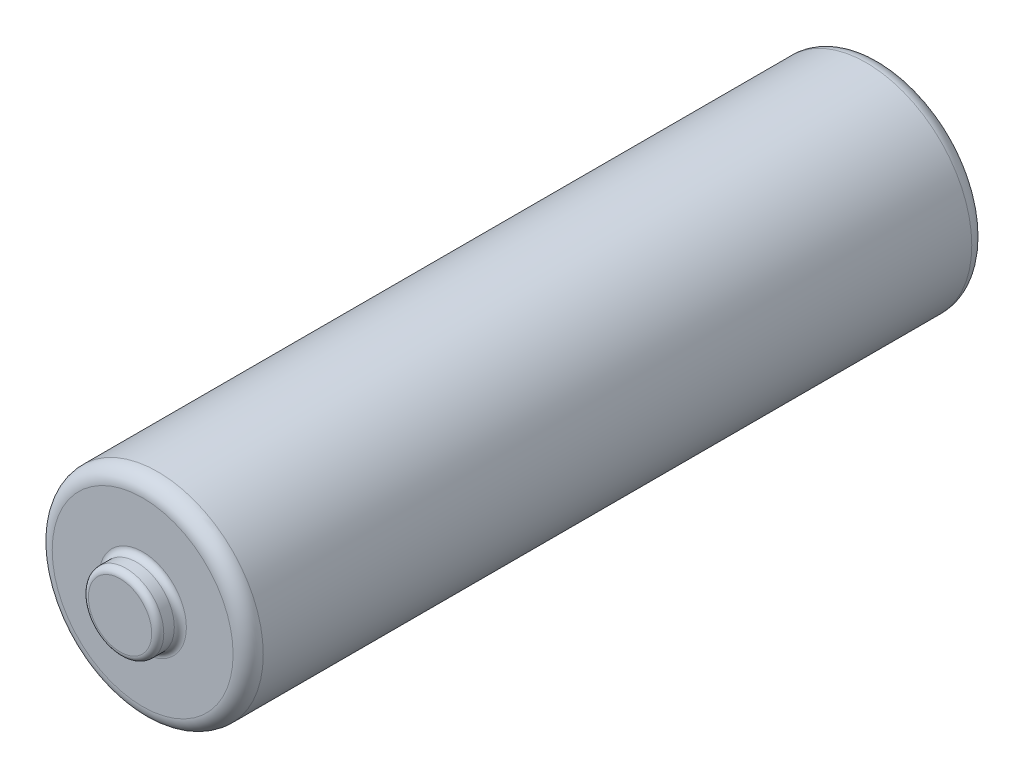
ISO-10303-21;
HEADER;
FILE_DESCRIPTION(('STEP AP214'),'2;1');
FILE_NAME('part.step','',(''),(''),'','','');
FILE_SCHEMA(('AUTOMOTIVE_DESIGN { 1 0 10303 214 1 1 1 1 }'));
ENDSEC;
DATA;
#1=APPLICATION_CONTEXT('core data for automotive mechanical design processes');
#2=APPLICATION_PROTOCOL_DEFINITION('international standard','automotive_design',2000,#1);
#3=PRODUCT_CONTEXT('',#1,'mechanical');
#4=PRODUCT('Part','Part','',(#3));
#5=PRODUCT_RELATED_PRODUCT_CATEGORY('part','',(#4));
#6=PRODUCT_DEFINITION_FORMATION('','',#4);
#7=PRODUCT_DEFINITION_CONTEXT('part definition',#1,'design');
#8=PRODUCT_DEFINITION('design','',#6,#7);
#9=PRODUCT_DEFINITION_SHAPE('','',#8);
#10=(LENGTH_UNIT() NAMED_UNIT(*) SI_UNIT(.MILLI.,.METRE.));
#11=(NAMED_UNIT(*) PLANE_ANGLE_UNIT() SI_UNIT($,.RADIAN.));
#12=(NAMED_UNIT(*) SI_UNIT($,.STERADIAN.) SOLID_ANGLE_UNIT());
#13=UNCERTAINTY_MEASURE_WITH_UNIT(LENGTH_MEASURE(1.E-05),#10,'distance_accuracy_value','');
#14=(GEOMETRIC_REPRESENTATION_CONTEXT(3) GLOBAL_UNCERTAINTY_ASSIGNED_CONTEXT((#13)) GLOBAL_UNIT_ASSIGNED_CONTEXT((#10,
#11,#12)) REPRESENTATION_CONTEXT('',''));
#15=CARTESIAN_POINT('',(0.,0.,0.));
#16=DIRECTION('',(0.,0.,1.));
#17=DIRECTION('',(1.,0.,0.));
#18=AXIS2_PLACEMENT_3D('',#15,#16,#17);
#19=CARTESIAN_POINT('',(0.,0.,49.));
#20=DIRECTION('',(0.,0.,1.));
#21=DIRECTION('',(1.,0.,0.));
#22=AXIS2_PLACEMENT_3D('',#19,#20,#21);
#23=PLANE('',#22);
#24=CARTESIAN_POINT('',(0.,0.,49.));
#25=DIRECTION('',(0.,0.,1.));
#26=DIRECTION('',(1.,0.,0.));
#27=AXIS2_PLACEMENT_3D('',#24,#25,#26);
#28=CIRCLE('',#27,2.9);
#29=CARTESIAN_POINT('',(2.9,0.,49.));
#30=VERTEX_POINT('',#29);
#31=EDGE_CURVE('E12',#30,#30,#28,.F.);
#32=ORIENTED_EDGE('',*,*,#31,.T.);
#33=EDGE_LOOP('',(#32));
#34=FACE_BOUND('',#33,.T.);
#35=CARTESIAN_POINT('',(0.,0.,49.));
#36=DIRECTION('',(0.,0.,1.));
#37=DIRECTION('',(1.,0.,0.));
#38=AXIS2_PLACEMENT_3D('',#35,#36,#37);
#39=CIRCLE('',#38,6.);
#40=CARTESIAN_POINT('',(6.,0.,49.));
#41=VERTEX_POINT('',#40);
#42=EDGE_CURVE('E64',#41,#41,#39,.T.);
#43=ORIENTED_EDGE('',*,*,#42,.T.);
#44=EDGE_LOOP('',(#43));
#45=FACE_BOUND('',#44,.T.);
#46=ADVANCED_FACE('F44',(#34,#45),#23,.T.);
#47=CARTESIAN_POINT('',(0.,0.,49.));
#48=DIRECTION('',(0.,0.,-1.));
#49=DIRECTION('',(-1.,0.,0.));
#50=AXIS2_PLACEMENT_3D('',#47,#48,#49);
#51=CYLINDRICAL_SURFACE('',#50,7.);
#52=CARTESIAN_POINT('',(0.,0.,1.));
#53=DIRECTION('',(0.,0.,1.));
#54=DIRECTION('',(1.,0.,0.));
#55=AXIS2_PLACEMENT_3D('',#52,#53,#54);
#56=CIRCLE('',#55,7.);
#57=CARTESIAN_POINT('',(7.,0.,1.));
#58=VERTEX_POINT('',#57);
#59=EDGE_CURVE('E70',#58,#58,#56,.T.);
#60=ORIENTED_EDGE('',*,*,#59,.T.);
#61=EDGE_LOOP('',(#60));
#62=FACE_BOUND('',#61,.T.);
#63=CARTESIAN_POINT('',(0.,0.,48.));
#64=DIRECTION('',(0.,0.,1.));
#65=DIRECTION('',(1.,0.,0.));
#66=AXIS2_PLACEMENT_3D('',#63,#64,#65);
#67=CIRCLE('',#66,7.);
#68=CARTESIAN_POINT('',(7.,0.,48.));
#69=VERTEX_POINT('',#68);
#70=EDGE_CURVE('E73',#69,#69,#67,.F.);
#71=ORIENTED_EDGE('',*,*,#70,.T.);
#72=EDGE_LOOP('',(#71));
#73=FACE_BOUND('',#72,.T.);
#74=ADVANCED_FACE('F77',(#62,#73),#51,.T.);
#75=CARTESIAN_POINT('',(0.,0.,0.));
#76=DIRECTION('',(0.,0.,1.));
#77=DIRECTION('',(1.,0.,0.));
#78=AXIS2_PLACEMENT_3D('',#75,#76,#77);
#79=PLANE('',#78);
#80=CARTESIAN_POINT('',(0.,0.,0.));
#81=DIRECTION('',(0.,0.,1.));
#82=DIRECTION('',(1.,0.,0.));
#83=AXIS2_PLACEMENT_3D('',#80,#81,#82);
#84=CIRCLE('',#83,6.);
#85=CARTESIAN_POINT('',(6.,0.,0.));
#86=VERTEX_POINT('',#85);
#87=EDGE_CURVE('E67',#86,#86,#84,.F.);
#88=ORIENTED_EDGE('',*,*,#87,.T.);
#89=EDGE_LOOP('',(#88));
#90=FACE_BOUND('',#89,.T.);
#91=ADVANCED_FACE('F92',(#90),#79,.F.);
#92=CARTESIAN_POINT('',(0.,0.,50.5));
#93=DIRECTION('',(0.,0.,-1.));
#94=DIRECTION('',(-1.,0.,0.));
#95=AXIS2_PLACEMENT_3D('',#92,#93,#94);
#96=CYLINDRICAL_SURFACE('',#95,2.5);
#97=CARTESIAN_POINT('',(0.,0.,50.1));
#98=DIRECTION('',(0.,0.,1.));
#99=DIRECTION('',(1.,0.,0.));
#100=AXIS2_PLACEMENT_3D('',#97,#98,#99);
#101=CIRCLE('',#100,2.5);
#102=CARTESIAN_POINT('',(2.5,0.,50.1));
#103=VERTEX_POINT('',#102);
#104=EDGE_CURVE('E51',#103,#103,#101,.F.);
#105=ORIENTED_EDGE('',*,*,#104,.T.);
#106=EDGE_LOOP('',(#105));
#107=FACE_BOUND('',#106,.T.);
#108=CARTESIAN_POINT('',(0.,0.,49.4));
#109=DIRECTION('',(0.,0.,1.));
#110=DIRECTION('',(1.,0.,0.));
#111=AXIS2_PLACEMENT_3D('',#108,#109,#110);
#112=CIRCLE('',#111,2.5);
#113=CARTESIAN_POINT('',(2.5,0.,49.4));
#114=VERTEX_POINT('',#113);
#115=EDGE_CURVE('E55',#114,#114,#112,.T.);
#116=ORIENTED_EDGE('',*,*,#115,.T.);
#117=EDGE_LOOP('',(#116));
#118=FACE_BOUND('',#117,.T.);
#119=ADVANCED_FACE('F97',(#107,#118),#96,.T.);
#120=CARTESIAN_POINT('',(0.,0.,50.5));
#121=DIRECTION('',(0.,0.,1.));
#122=DIRECTION('',(1.,0.,0.));
#123=AXIS2_PLACEMENT_3D('',#120,#121,#122);
#124=PLANE('',#123);
#125=CARTESIAN_POINT('',(0.,0.,50.5));
#126=DIRECTION('',(0.,0.,1.));
#127=DIRECTION('',(1.,0.,0.));
#128=AXIS2_PLACEMENT_3D('',#125,#126,#127);
#129=CIRCLE('',#128,2.1);
#130=CARTESIAN_POINT('',(2.1,0.,50.5));
#131=VERTEX_POINT('',#130);
#132=EDGE_CURVE('E59',#131,#131,#129,.T.);
#133=ORIENTED_EDGE('',*,*,#132,.T.);
#134=EDGE_LOOP('',(#133));
#135=FACE_BOUND('',#134,.T.);
#136=ADVANCED_FACE('F103',(#135),#124,.T.);
#137=CARTESIAN_POINT('',(0.,0.,1.));
#138=DIRECTION('',(0.,0.,1.));
#139=DIRECTION('',(1.,0.,0.));
#140=AXIS2_PLACEMENT_3D('',#137,#138,#139);
#141=TOROIDAL_SURFACE('',#140,6.,1.);
#142=ORIENTED_EDGE('',*,*,#87,.F.);
#143=EDGE_LOOP('',(#142));
#144=FACE_BOUND('',#143,.T.);
#145=ORIENTED_EDGE('',*,*,#59,.F.);
#146=EDGE_LOOP('',(#145));
#147=FACE_BOUND('',#146,.T.);
#148=ADVANCED_FACE('F83',(#144,#147),#141,.T.);
#149=CARTESIAN_POINT('',(0.,0.,48.));
#150=DIRECTION('',(0.,0.,1.));
#151=DIRECTION('',(1.,0.,0.));
#152=AXIS2_PLACEMENT_3D('',#149,#150,#151);
#153=TOROIDAL_SURFACE('',#152,6.,1.);
#154=ORIENTED_EDGE('',*,*,#70,.F.);
#155=EDGE_LOOP('',(#154));
#156=FACE_BOUND('',#155,.T.);
#157=ORIENTED_EDGE('',*,*,#42,.F.);
#158=EDGE_LOOP('',(#157));
#159=FACE_BOUND('',#158,.T.);
#160=ADVANCED_FACE('F79',(#156,#159),#153,.T.);
#161=CARTESIAN_POINT('',(0.,0.,50.1));
#162=DIRECTION('',(0.,0.,1.));
#163=DIRECTION('',(1.,0.,0.));
#164=AXIS2_PLACEMENT_3D('',#161,#162,#163);
#165=TOROIDAL_SURFACE('',#164,2.1,0.4);
#166=ORIENTED_EDGE('',*,*,#104,.F.);
#167=EDGE_LOOP('',(#166));
#168=FACE_BOUND('',#167,.T.);
#169=ORIENTED_EDGE('',*,*,#132,.F.);
#170=EDGE_LOOP('',(#169));
#171=FACE_BOUND('',#170,.T.);
#172=ADVANCED_FACE('F82',(#168,#171),#165,.T.);
#173=CARTESIAN_POINT('',(0.,0.,49.4));
#174=DIRECTION('',(0.,0.,1.));
#175=DIRECTION('',(1.,0.,0.));
#176=AXIS2_PLACEMENT_3D('',#173,#174,#175);
#177=TOROIDAL_SURFACE('',#176,2.9,0.4);
#178=ORIENTED_EDGE('',*,*,#31,.F.);
#179=EDGE_LOOP('',(#178));
#180=FACE_BOUND('',#179,.T.);
#181=ORIENTED_EDGE('',*,*,#115,.F.);
#182=EDGE_LOOP('',(#181));
#183=FACE_BOUND('',#182,.T.);
#184=ADVANCED_FACE('F46',(#180,#183),#177,.F.);
#185=CLOSED_SHELL('',(#46,#74,#91,#119,#136,#148,#160,#172,#184));
#186=MANIFOLD_SOLID_BREP('B2',#185);
#187=ADVANCED_BREP_SHAPE_REPRESENTATION('',(#18,#186),#14);
#188=SHAPE_DEFINITION_REPRESENTATION(#9,#187);
ENDSEC;
END-ISO-10303-21;
